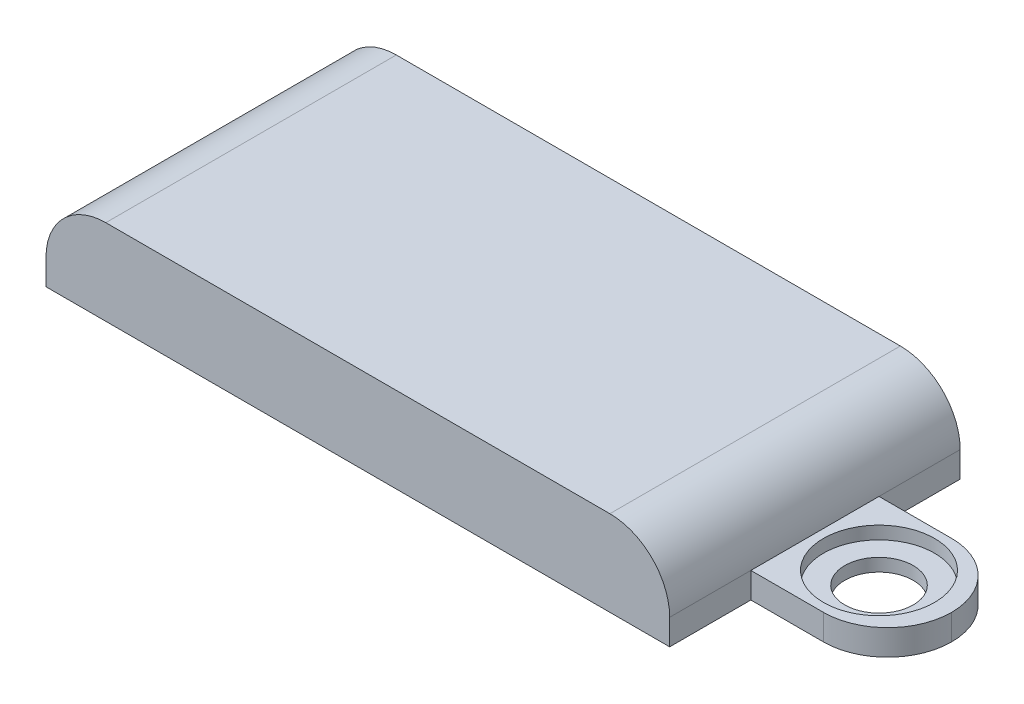
ISO-10303-21;
HEADER;
FILE_DESCRIPTION(('STEP AP214'),'2;1');
FILE_NAME('part.step','',(''),(''),'','','');
FILE_SCHEMA(('AUTOMOTIVE_DESIGN { 1 0 10303 214 1 1 1 1 }'));
ENDSEC;
DATA;
#1=APPLICATION_CONTEXT('core data for automotive mechanical design processes');
#2=APPLICATION_PROTOCOL_DEFINITION('international standard','automotive_design',2000,#1);
#3=PRODUCT_CONTEXT('',#1,'mechanical');
#4=PRODUCT('Part','Part','',(#3));
#5=PRODUCT_RELATED_PRODUCT_CATEGORY('part','',(#4));
#6=PRODUCT_DEFINITION_FORMATION('','',#4);
#7=PRODUCT_DEFINITION_CONTEXT('part definition',#1,'design');
#8=PRODUCT_DEFINITION('design','',#6,#7);
#9=PRODUCT_DEFINITION_SHAPE('','',#8);
#10=(LENGTH_UNIT() NAMED_UNIT(*) SI_UNIT(.MILLI.,.METRE.));
#11=(NAMED_UNIT(*) PLANE_ANGLE_UNIT() SI_UNIT($,.RADIAN.));
#12=(NAMED_UNIT(*) SI_UNIT($,.STERADIAN.) SOLID_ANGLE_UNIT());
#13=UNCERTAINTY_MEASURE_WITH_UNIT(LENGTH_MEASURE(1.E-05),#10,'distance_accuracy_value','');
#14=(GEOMETRIC_REPRESENTATION_CONTEXT(3) GLOBAL_UNCERTAINTY_ASSIGNED_CONTEXT((#13)) GLOBAL_UNIT_ASSIGNED_CONTEXT((#10,
#11,#12)) REPRESENTATION_CONTEXT('',''));
#15=CARTESIAN_POINT('',(0.,0.,0.));
#16=DIRECTION('',(0.,0.,1.));
#17=DIRECTION('',(1.,0.,0.));
#18=AXIS2_PLACEMENT_3D('',#15,#16,#17);
#19=CARTESIAN_POINT('',(47.5139751552795,0.,1.64052795031056));
#20=DIRECTION('',(0.,1.,0.));
#21=DIRECTION('',(0.,0.,1.));
#22=AXIS2_PLACEMENT_3D('',#19,#20,#21);
#23=CYLINDRICAL_SURFACE('',#22,4.00000000000001);
#24=CARTESIAN_POINT('',(47.5139751552795,0.,1.64052795031056));
#25=DIRECTION('',(0.,1.,0.));
#26=DIRECTION('',(0.,0.,1.));
#27=AXIS2_PLACEMENT_3D('',#24,#25,#26);
#28=CIRCLE('',#27,4.00000000000001);
#29=CARTESIAN_POINT('',(47.5139751552795,0.,5.64052795031056));
#30=VERTEX_POINT('',#29);
#31=EDGE_CURVE('E190',#30,#30,#28,.T.);
#32=ORIENTED_EDGE('',*,*,#31,.F.);
#33=EDGE_LOOP('',(#32));
#34=FACE_BOUND('',#33,.T.);
#35=CARTESIAN_POINT('',(47.5139751552795,1.5,1.64052795031056));
#36=DIRECTION('',(0.,1.,0.));
#37=DIRECTION('',(0.,0.,1.));
#38=AXIS2_PLACEMENT_3D('',#35,#36,#37);
#39=CIRCLE('',#38,4.00000000000001);
#40=CARTESIAN_POINT('',(47.5139751552795,1.5,5.64052795031056));
#41=VERTEX_POINT('',#40);
#42=EDGE_CURVE('E38',#41,#41,#39,.F.);
#43=ORIENTED_EDGE('',*,*,#42,.F.);
#44=EDGE_LOOP('',(#43));
#45=FACE_BOUND('',#44,.T.);
#46=ADVANCED_FACE('F34',(#34,#45),#23,.F.);
#47=CARTESIAN_POINT('',(40.0139751552795,10.,-15.3594720496894));
#48=DIRECTION('',(-1.,0.,0.));
#49=DIRECTION('',(0.,0.,1.));
#50=AXIS2_PLACEMENT_3D('',#47,#48,#49);
#51=PLANE('',#50);
#52=DIRECTION('',(0.,0.,-1.));
#53=VECTOR('',#52,1.);
#54=CARTESIAN_POINT('',(40.0139751552795,0.,-15.3594720496894));
#55=LINE('',#54,#53);
#56=CARTESIAN_POINT('',(40.0139751552795,0.,18.6405279503106));
#57=VERTEX_POINT('',#56);
#58=CARTESIAN_POINT('',(40.0139751552795,0.,9.14052795031055));
#59=VERTEX_POINT('',#58);
#60=EDGE_CURVE('E178',#57,#59,#55,.T.);
#61=ORIENTED_EDGE('',*,*,#60,.T.);
#62=DIRECTION('',(0.,-1.,0.));
#63=VECTOR('',#62,1.);
#64=CARTESIAN_POINT('',(40.0139751552795,3.,9.14052795031055));
#65=LINE('',#64,#63);
#66=CARTESIAN_POINT('',(40.0139751552795,3.,9.14052795031055));
#67=VERTEX_POINT('',#66);
#68=EDGE_CURVE('E156',#67,#59,#65,.T.);
#69=ORIENTED_EDGE('',*,*,#68,.F.);
#70=DIRECTION('',(0.,0.,-1.));
#71=VECTOR('',#70,1.);
#72=CARTESIAN_POINT('',(40.0139751552795,3.,18.6405279503106));
#73=LINE('',#72,#71);
#74=CARTESIAN_POINT('',(40.0139751552795,3.,18.6405279503106));
#75=VERTEX_POINT('',#74);
#76=EDGE_CURVE('E163',#67,#75,#73,.F.);
#77=ORIENTED_EDGE('',*,*,#76,.T.);
#78=DIRECTION('',(0.,-1.,0.));
#79=VECTOR('',#78,1.);
#80=CARTESIAN_POINT('',(40.0139751552795,10.,18.6405279503106));
#81=LINE('',#80,#79);
#82=EDGE_CURVE('E244',#75,#57,#81,.T.);
#83=ORIENTED_EDGE('',*,*,#82,.T.);
#84=EDGE_LOOP('',(#61,#69,#77,#83));
#85=FACE_BOUND('',#84,.T.);
#86=ADVANCED_FACE('F176',(#85),#51,.F.);
#87=CARTESIAN_POINT('',(-32.9860248447205,10.,-15.3594720496894));
#88=DIRECTION('',(1.,0.,0.));
#89=DIRECTION('',(0.,0.,-1.));
#90=AXIS2_PLACEMENT_3D('',#87,#88,#89);
#91=PLANE('',#90);
#92=DIRECTION('',(0.,-1.,0.));
#93=VECTOR('',#92,1.);
#94=CARTESIAN_POINT('',(-32.9860248447205,10.,18.6405279503106));
#95=LINE('',#94,#93);
#96=CARTESIAN_POINT('',(-32.9860248447205,3.,18.6405279503106));
#97=VERTEX_POINT('',#96);
#98=CARTESIAN_POINT('',(-32.9860248447205,0.,18.6405279503106));
#99=VERTEX_POINT('',#98);
#100=EDGE_CURVE('E246',#97,#99,#95,.T.);
#101=ORIENTED_EDGE('',*,*,#100,.F.);
#102=DIRECTION('',(0.,0.,1.));
#103=VECTOR('',#102,1.);
#104=CARTESIAN_POINT('',(-32.9860248447205,3.,-15.3594720496894));
#105=LINE('',#104,#103);
#106=CARTESIAN_POINT('',(-32.9860248447205,3.,-15.3594720496894));
#107=VERTEX_POINT('',#106);
#108=EDGE_CURVE('E278',#97,#107,#105,.F.);
#109=ORIENTED_EDGE('',*,*,#108,.T.);
#110=DIRECTION('',(0.,-1.,0.));
#111=VECTOR('',#110,1.);
#112=CARTESIAN_POINT('',(-32.9860248447205,10.,-15.3594720496894));
#113=LINE('',#112,#111);
#114=CARTESIAN_POINT('',(-32.9860248447205,0.,-15.3594720496894));
#115=VERTEX_POINT('',#114);
#116=EDGE_CURVE('E230',#107,#115,#113,.T.);
#117=ORIENTED_EDGE('',*,*,#116,.T.);
#118=DIRECTION('',(0.,0.,1.));
#119=VECTOR('',#118,1.);
#120=CARTESIAN_POINT('',(-32.9860248447205,0.,-15.3594720496894));
#121=LINE('',#120,#119);
#122=EDGE_CURVE('E217',#115,#99,#121,.T.);
#123=ORIENTED_EDGE('',*,*,#122,.T.);
#124=EDGE_LOOP('',(#101,#109,#117,#123));
#125=FACE_BOUND('',#124,.T.);
#126=ADVANCED_FACE('F326',(#125),#91,.F.);
#127=CARTESIAN_POINT('',(-32.9860248447205,10.,18.6405279503106));
#128=DIRECTION('',(0.,0.,-1.));
#129=DIRECTION('',(-1.,0.,0.));
#130=AXIS2_PLACEMENT_3D('',#127,#128,#129);
#131=PLANE('',#130);
#132=ORIENTED_EDGE('',*,*,#82,.F.);
#133=CARTESIAN_POINT('',(33.0139751552795,3.,18.6405279503106));
#134=DIRECTION('',(0.,0.,-1.));
#135=DIRECTION('',(-1.,0.,0.));
#136=AXIS2_PLACEMENT_3D('',#133,#134,#135);
#137=CIRCLE('',#136,7.);
#138=CARTESIAN_POINT('',(33.0139751552795,10.,18.6405279503106));
#139=VERTEX_POINT('',#138);
#140=EDGE_CURVE('E169',#75,#139,#137,.F.);
#141=ORIENTED_EDGE('',*,*,#140,.T.);
#142=DIRECTION('',(1.,0.,0.));
#143=VECTOR('',#142,1.);
#144=CARTESIAN_POINT('',(-32.9860248447205,10.,18.6405279503106));
#145=LINE('',#144,#143);
#146=CARTESIAN_POINT('',(-25.9860248447205,10.,18.6405279503106));
#147=VERTEX_POINT('',#146);
#148=EDGE_CURVE('E223',#147,#139,#145,.T.);
#149=ORIENTED_EDGE('',*,*,#148,.F.);
#150=CARTESIAN_POINT('',(-25.9860248447205,3.,18.6405279503106));
#151=DIRECTION('',(0.,0.,-1.));
#152=DIRECTION('',(-1.,0.,0.));
#153=AXIS2_PLACEMENT_3D('',#150,#151,#152);
#154=CIRCLE('',#153,7.);
#155=EDGE_CURVE('E275',#147,#97,#154,.F.);
#156=ORIENTED_EDGE('',*,*,#155,.T.);
#157=ORIENTED_EDGE('',*,*,#100,.T.);
#158=DIRECTION('',(1.,0.,0.));
#159=VECTOR('',#158,1.);
#160=CARTESIAN_POINT('',(-32.9860248447205,0.,18.6405279503106));
#161=LINE('',#160,#159);
#162=EDGE_CURVE('E233',#99,#57,#161,.T.);
#163=ORIENTED_EDGE('',*,*,#162,.T.);
#164=EDGE_LOOP('',(#132,#141,#149,#156,#157,#163));
#165=FACE_BOUND('',#164,.T.);
#166=ADVANCED_FACE('F359',(#165),#131,.F.);
#167=CARTESIAN_POINT('',(40.0139751552795,3.,-15.3594720496894));
#168=VERTEX_POINT('',#167);
#169=CARTESIAN_POINT('',(40.0139751552795,3.,-5.85947204968944));
#170=VERTEX_POINT('',#169);
#171=EDGE_CURVE('E172',#168,#170,#73,.F.);
#172=ORIENTED_EDGE('',*,*,#171,.T.);
#173=DIRECTION('',(0.,-1.,0.));
#174=VECTOR('',#173,1.);
#175=CARTESIAN_POINT('',(40.0139751552795,3.,-5.85947204968944));
#176=LINE('',#175,#174);
#177=CARTESIAN_POINT('',(40.0139751552795,0.,-5.85947204968944));
#178=VERTEX_POINT('',#177);
#179=EDGE_CURVE('E158',#170,#178,#176,.T.);
#180=ORIENTED_EDGE('',*,*,#179,.T.);
#181=CARTESIAN_POINT('',(40.0139751552795,0.,-15.3594720496894));
#182=VERTEX_POINT('',#181);
#183=EDGE_CURVE('E236',#178,#182,#55,.T.);
#184=ORIENTED_EDGE('',*,*,#183,.T.);
#185=DIRECTION('',(0.,-1.,0.));
#186=VECTOR('',#185,1.);
#187=CARTESIAN_POINT('',(40.0139751552795,10.,-15.3594720496894));
#188=LINE('',#187,#186);
#189=EDGE_CURVE('E241',#168,#182,#188,.T.);
#190=ORIENTED_EDGE('',*,*,#189,.F.);
#191=EDGE_LOOP('',(#172,#180,#184,#190));
#192=FACE_BOUND('',#191,.T.);
#193=ADVANCED_FACE('F328',(#192),#51,.F.);
#194=CARTESIAN_POINT('',(-32.9860248447205,10.,-15.3594720496894));
#195=DIRECTION('',(0.,0.,1.));
#196=DIRECTION('',(1.,0.,0.));
#197=AXIS2_PLACEMENT_3D('',#194,#195,#196);
#198=PLANE('',#197);
#199=DIRECTION('',(-1.,0.,0.));
#200=VECTOR('',#199,1.);
#201=CARTESIAN_POINT('',(-32.9860248447205,10.,-15.3594720496894));
#202=LINE('',#201,#200);
#203=CARTESIAN_POINT('',(33.0139751552795,10.,-15.3594720496894));
#204=VERTEX_POINT('',#203);
#205=CARTESIAN_POINT('',(-25.9860248447205,10.,-15.3594720496894));
#206=VERTEX_POINT('',#205);
#207=EDGE_CURVE('E226',#204,#206,#202,.T.);
#208=ORIENTED_EDGE('',*,*,#207,.F.);
#209=CARTESIAN_POINT('',(33.0139751552795,3.,-15.3594720496894));
#210=DIRECTION('',(0.,0.,1.));
#211=DIRECTION('',(1.,0.,0.));
#212=AXIS2_PLACEMENT_3D('',#209,#210,#211);
#213=CIRCLE('',#212,7.);
#214=EDGE_CURVE('E173',#204,#168,#213,.F.);
#215=ORIENTED_EDGE('',*,*,#214,.T.);
#216=ORIENTED_EDGE('',*,*,#189,.T.);
#217=DIRECTION('',(-1.,0.,0.));
#218=VECTOR('',#217,1.);
#219=CARTESIAN_POINT('',(-32.9860248447205,0.,-15.3594720496894));
#220=LINE('',#219,#218);
#221=EDGE_CURVE('E227',#182,#115,#220,.T.);
#222=ORIENTED_EDGE('',*,*,#221,.T.);
#223=ORIENTED_EDGE('',*,*,#116,.F.);
#224=CARTESIAN_POINT('',(-25.9860248447205,3.,-15.3594720496894));
#225=DIRECTION('',(0.,0.,1.));
#226=DIRECTION('',(1.,0.,0.));
#227=AXIS2_PLACEMENT_3D('',#224,#225,#226);
#228=CIRCLE('',#227,7.);
#229=EDGE_CURVE('E272',#107,#206,#228,.F.);
#230=ORIENTED_EDGE('',*,*,#229,.T.);
#231=EDGE_LOOP('',(#208,#215,#216,#222,#223,#230));
#232=FACE_BOUND('',#231,.T.);
#233=ADVANCED_FACE('F365',(#232),#198,.F.);
#234=CARTESIAN_POINT('',(0.,10.,0.));
#235=DIRECTION('',(0.,1.,0.));
#236=DIRECTION('',(0.,0.,1.));
#237=AXIS2_PLACEMENT_3D('',#234,#235,#236);
#238=PLANE('',#237);
#239=ORIENTED_EDGE('',*,*,#148,.T.);
#240=DIRECTION('',(0.,0.,-1.));
#241=VECTOR('',#240,1.);
#242=CARTESIAN_POINT('',(33.0139751552795,10.,-15.3594720496894));
#243=LINE('',#242,#241);
#244=EDGE_CURVE('E269',#139,#204,#243,.T.);
#245=ORIENTED_EDGE('',*,*,#244,.T.);
#246=ORIENTED_EDGE('',*,*,#207,.T.);
#247=DIRECTION('',(0.,0.,1.));
#248=VECTOR('',#247,1.);
#249=CARTESIAN_POINT('',(-25.9860248447205,10.,18.6405279503106));
#250=LINE('',#249,#248);
#251=EDGE_CURVE('E266',#206,#147,#250,.T.);
#252=ORIENTED_EDGE('',*,*,#251,.T.);
#253=EDGE_LOOP('',(#239,#245,#246,#252));
#254=FACE_BOUND('',#253,.T.);
#255=ADVANCED_FACE('F369',(#254),#238,.T.);
#256=CARTESIAN_POINT('',(0.,0.,0.));
#257=DIRECTION('',(0.,1.,0.));
#258=DIRECTION('',(0.,0.,1.));
#259=AXIS2_PLACEMENT_3D('',#256,#257,#258);
#260=PLANE('',#259);
#261=ORIENTED_EDGE('',*,*,#31,.T.);
#262=EDGE_LOOP('',(#261));
#263=FACE_BOUND('',#262,.T.);
#264=DIRECTION('',(1.,0.,0.));
#265=VECTOR('',#264,1.);
#266=CARTESIAN_POINT('',(-31.4860248447205,0.,-13.8594720496894));
#267=LINE('',#266,#265);
#268=CARTESIAN_POINT('',(-31.4860248447205,0.,-13.8594720496894));
#269=VERTEX_POINT('',#268);
#270=CARTESIAN_POINT('',(38.5139751552795,0.,-13.8594720496894));
#271=VERTEX_POINT('',#270);
#272=EDGE_CURVE('E207',#269,#271,#267,.T.);
#273=ORIENTED_EDGE('',*,*,#272,.F.);
#274=DIRECTION('',(0.,0.,-1.));
#275=VECTOR('',#274,1.);
#276=CARTESIAN_POINT('',(-31.4860248447205,0.,17.1405279503106));
#277=LINE('',#276,#275);
#278=CARTESIAN_POINT('',(-31.4860248447205,0.,17.1405279503106));
#279=VERTEX_POINT('',#278);
#280=EDGE_CURVE('E179',#279,#269,#277,.T.);
#281=ORIENTED_EDGE('',*,*,#280,.F.);
#282=DIRECTION('',(-1.,0.,0.));
#283=VECTOR('',#282,1.);
#284=CARTESIAN_POINT('',(-31.4860248447205,0.,17.1405279503106));
#285=LINE('',#284,#283);
#286=CARTESIAN_POINT('',(38.5139751552795,0.,17.1405279503106));
#287=VERTEX_POINT('',#286);
#288=EDGE_CURVE('E201',#287,#279,#285,.T.);
#289=ORIENTED_EDGE('',*,*,#288,.F.);
#290=DIRECTION('',(0.,0.,1.));
#291=VECTOR('',#290,1.);
#292=CARTESIAN_POINT('',(38.5139751552795,0.,17.1405279503106));
#293=LINE('',#292,#291);
#294=EDGE_CURVE('E210',#271,#287,#293,.T.);
#295=ORIENTED_EDGE('',*,*,#294,.F.);
#296=EDGE_LOOP('',(#273,#281,#289,#295));
#297=FACE_BOUND('',#296,.T.);
#298=DIRECTION('',(1.,0.,0.));
#299=VECTOR('',#298,1.);
#300=CARTESIAN_POINT('',(40.0139751552795,0.,-5.85947204968944));
#301=LINE('',#300,#299);
#302=CARTESIAN_POINT('',(48.5139751552795,0.,-5.85947204968944));
#303=VERTEX_POINT('',#302);
#304=EDGE_CURVE('E187',#178,#303,#301,.T.);
#305=ORIENTED_EDGE('',*,*,#304,.T.);
#306=CARTESIAN_POINT('',(48.5139751552795,0.,1.64052795031056));
#307=DIRECTION('',(0.,1.,0.));
#308=DIRECTION('',(0.,0.,1.));
#309=AXIS2_PLACEMENT_3D('',#306,#307,#308);
#310=CIRCLE('',#309,7.5);
#311=CARTESIAN_POINT('',(56.0139751552795,0.,1.64052795031056));
#312=VERTEX_POINT('',#311);
#313=EDGE_CURVE('E285',#303,#312,#310,.F.);
#314=ORIENTED_EDGE('',*,*,#313,.T.);
#315=CARTESIAN_POINT('',(48.5139751552795,0.,1.64052795031056));
#316=DIRECTION('',(0.,1.,0.));
#317=DIRECTION('',(0.,0.,1.));
#318=AXIS2_PLACEMENT_3D('',#315,#316,#317);
#319=CIRCLE('',#318,7.5);
#320=CARTESIAN_POINT('',(48.5139751552795,0.,9.14052795031056));
#321=VERTEX_POINT('',#320);
#322=EDGE_CURVE('E283',#312,#321,#319,.F.);
#323=ORIENTED_EDGE('',*,*,#322,.T.);
#324=DIRECTION('',(-1.,0.,0.));
#325=VECTOR('',#324,1.);
#326=CARTESIAN_POINT('',(40.0139751552795,0.,9.14052795031055));
#327=LINE('',#326,#325);
#328=EDGE_CURVE('E184',#321,#59,#327,.T.);
#329=ORIENTED_EDGE('',*,*,#328,.T.);
#330=ORIENTED_EDGE('',*,*,#60,.F.);
#331=ORIENTED_EDGE('',*,*,#162,.F.);
#332=ORIENTED_EDGE('',*,*,#122,.F.);
#333=ORIENTED_EDGE('',*,*,#221,.F.);
#334=ORIENTED_EDGE('',*,*,#183,.F.);
#335=EDGE_LOOP('',(#305,#314,#323,#329,#330,#331,#332,#333,#334));
#336=FACE_BOUND('',#335,.T.);
#337=ADVANCED_FACE('F371',(#263,#297,#336),#260,.F.);
#338=CARTESIAN_POINT('',(-31.4860248447205,8.5,17.1405279503106));
#339=DIRECTION('',(-1.,0.,0.));
#340=DIRECTION('',(0.,0.,1.));
#341=AXIS2_PLACEMENT_3D('',#338,#339,#340);
#342=PLANE('',#341);
#343=DIRECTION('',(0.,-1.,0.));
#344=VECTOR('',#343,1.);
#345=CARTESIAN_POINT('',(-31.4860248447205,8.5,-13.8594720496894));
#346=LINE('',#345,#344);
#347=CARTESIAN_POINT('',(-31.4860248447205,3.,-13.8594720496894));
#348=VERTEX_POINT('',#347);
#349=EDGE_CURVE('E204',#348,#269,#346,.T.);
#350=ORIENTED_EDGE('',*,*,#349,.F.);
#351=DIRECTION('',(0.,0.,-1.));
#352=VECTOR('',#351,1.);
#353=CARTESIAN_POINT('',(-31.4860248447205,3.,17.1405279503106));
#354=LINE('',#353,#352);
#355=CARTESIAN_POINT('',(-31.4860248447205,3.,17.1405279503106));
#356=VERTEX_POINT('',#355);
#357=EDGE_CURVE('E264',#348,#356,#354,.F.);
#358=ORIENTED_EDGE('',*,*,#357,.T.);
#359=DIRECTION('',(0.,-1.,0.));
#360=VECTOR('',#359,1.);
#361=CARTESIAN_POINT('',(-31.4860248447205,8.5,17.1405279503106));
#362=LINE('',#361,#360);
#363=EDGE_CURVE('E215',#356,#279,#362,.T.);
#364=ORIENTED_EDGE('',*,*,#363,.T.);
#365=ORIENTED_EDGE('',*,*,#280,.T.);
#366=EDGE_LOOP('',(#350,#358,#364,#365));
#367=FACE_BOUND('',#366,.T.);
#368=ADVANCED_FACE('F374',(#367),#342,.F.);
#369=CARTESIAN_POINT('',(-31.4860248447205,8.5,17.1405279503106));
#370=DIRECTION('',(0.,0.,1.));
#371=DIRECTION('',(1.,0.,0.));
#372=AXIS2_PLACEMENT_3D('',#369,#370,#371);
#373=PLANE('',#372);
#374=DIRECTION('',(-1.,0.,0.));
#375=VECTOR('',#374,1.);
#376=CARTESIAN_POINT('',(-31.4860248447205,8.5,17.1405279503106));
#377=LINE('',#376,#375);
#378=CARTESIAN_POINT('',(33.0139751552795,8.5,17.1405279503106));
#379=VERTEX_POINT('',#378);
#380=CARTESIAN_POINT('',(-25.9860248447205,8.5,17.1405279503106));
#381=VERTEX_POINT('',#380);
#382=EDGE_CURVE('E200',#379,#381,#377,.T.);
#383=ORIENTED_EDGE('',*,*,#382,.F.);
#384=CARTESIAN_POINT('',(33.0139751552795,3.,17.1405279503106));
#385=DIRECTION('',(0.,0.,1.));
#386=DIRECTION('',(1.,0.,0.));
#387=AXIS2_PLACEMENT_3D('',#384,#385,#386);
#388=CIRCLE('',#387,5.5);
#389=CARTESIAN_POINT('',(38.5139751552795,3.,17.1405279503106));
#390=VERTEX_POINT('',#389);
#391=EDGE_CURVE('E256',#379,#390,#388,.F.);
#392=ORIENTED_EDGE('',*,*,#391,.T.);
#393=DIRECTION('',(0.,-1.,0.));
#394=VECTOR('',#393,1.);
#395=CARTESIAN_POINT('',(38.5139751552795,8.5,17.1405279503106));
#396=LINE('',#395,#394);
#397=EDGE_CURVE('E218',#390,#287,#396,.T.);
#398=ORIENTED_EDGE('',*,*,#397,.T.);
#399=ORIENTED_EDGE('',*,*,#288,.T.);
#400=ORIENTED_EDGE('',*,*,#363,.F.);
#401=CARTESIAN_POINT('',(-25.9860248447205,3.,17.1405279503106));
#402=DIRECTION('',(0.,0.,1.));
#403=DIRECTION('',(1.,0.,0.));
#404=AXIS2_PLACEMENT_3D('',#401,#402,#403);
#405=CIRCLE('',#404,5.5);
#406=EDGE_CURVE('E254',#356,#381,#405,.F.);
#407=ORIENTED_EDGE('',*,*,#406,.T.);
#408=EDGE_LOOP('',(#383,#392,#398,#399,#400,#407));
#409=FACE_BOUND('',#408,.T.);
#410=ADVANCED_FACE('F380',(#409),#373,.F.);
#411=CARTESIAN_POINT('',(38.5139751552795,8.5,17.1405279503106));
#412=DIRECTION('',(1.,0.,0.));
#413=DIRECTION('',(0.,0.,-1.));
#414=AXIS2_PLACEMENT_3D('',#411,#412,#413);
#415=PLANE('',#414);
#416=ORIENTED_EDGE('',*,*,#397,.F.);
#417=DIRECTION('',(0.,0.,1.));
#418=VECTOR('',#417,1.);
#419=CARTESIAN_POINT('',(38.5139751552795,3.,17.1405279503106));
#420=LINE('',#419,#418);
#421=CARTESIAN_POINT('',(38.5139751552795,3.,-13.8594720496894));
#422=VERTEX_POINT('',#421);
#423=EDGE_CURVE('E258',#390,#422,#420,.F.);
#424=ORIENTED_EDGE('',*,*,#423,.T.);
#425=DIRECTION('',(0.,-1.,0.));
#426=VECTOR('',#425,1.);
#427=CARTESIAN_POINT('',(38.5139751552795,8.5,-13.8594720496894));
#428=LINE('',#427,#426);
#429=EDGE_CURVE('E220',#422,#271,#428,.T.);
#430=ORIENTED_EDGE('',*,*,#429,.T.);
#431=ORIENTED_EDGE('',*,*,#294,.T.);
#432=EDGE_LOOP('',(#416,#424,#430,#431));
#433=FACE_BOUND('',#432,.T.);
#434=ADVANCED_FACE('F385',(#433),#415,.F.);
#435=CARTESIAN_POINT('',(-31.4860248447205,8.5,-13.8594720496894));
#436=DIRECTION('',(0.,0.,-1.));
#437=DIRECTION('',(-1.,0.,0.));
#438=AXIS2_PLACEMENT_3D('',#435,#436,#437);
#439=PLANE('',#438);
#440=ORIENTED_EDGE('',*,*,#429,.F.);
#441=CARTESIAN_POINT('',(33.0139751552795,3.,-13.8594720496894));
#442=DIRECTION('',(0.,0.,-1.));
#443=DIRECTION('',(-1.,0.,0.));
#444=AXIS2_PLACEMENT_3D('',#441,#442,#443);
#445=CIRCLE('',#444,5.5);
#446=CARTESIAN_POINT('',(33.0139751552795,8.5,-13.8594720496894));
#447=VERTEX_POINT('',#446);
#448=EDGE_CURVE('E262',#422,#447,#445,.F.);
#449=ORIENTED_EDGE('',*,*,#448,.T.);
#450=DIRECTION('',(1.,0.,0.));
#451=VECTOR('',#450,1.);
#452=CARTESIAN_POINT('',(-31.4860248447205,8.5,-13.8594720496894));
#453=LINE('',#452,#451);
#454=CARTESIAN_POINT('',(-25.9860248447205,8.5,-13.8594720496894));
#455=VERTEX_POINT('',#454);
#456=EDGE_CURVE('E197',#455,#447,#453,.T.);
#457=ORIENTED_EDGE('',*,*,#456,.F.);
#458=CARTESIAN_POINT('',(-25.9860248447205,3.,-13.8594720496894));
#459=DIRECTION('',(0.,0.,-1.));
#460=DIRECTION('',(-1.,0.,0.));
#461=AXIS2_PLACEMENT_3D('',#458,#459,#460);
#462=CIRCLE('',#461,5.5);
#463=EDGE_CURVE('E260',#455,#348,#462,.F.);
#464=ORIENTED_EDGE('',*,*,#463,.T.);
#465=ORIENTED_EDGE('',*,*,#349,.T.);
#466=ORIENTED_EDGE('',*,*,#272,.T.);
#467=EDGE_LOOP('',(#440,#449,#457,#464,#465,#466));
#468=FACE_BOUND('',#467,.T.);
#469=ADVANCED_FACE('F382',(#468),#439,.F.);
#470=CARTESIAN_POINT('',(0.,8.5,0.));
#471=DIRECTION('',(0.,-1.,0.));
#472=DIRECTION('',(0.,0.,-1.));
#473=AXIS2_PLACEMENT_3D('',#470,#471,#472);
#474=PLANE('',#473);
#475=ORIENTED_EDGE('',*,*,#456,.T.);
#476=DIRECTION('',(0.,0.,1.));
#477=VECTOR('',#476,1.);
#478=CARTESIAN_POINT('',(33.0139751552795,8.5,0.));
#479=LINE('',#478,#477);
#480=EDGE_CURVE('E251',#447,#379,#479,.T.);
#481=ORIENTED_EDGE('',*,*,#480,.T.);
#482=ORIENTED_EDGE('',*,*,#382,.T.);
#483=DIRECTION('',(0.,0.,-1.));
#484=VECTOR('',#483,1.);
#485=CARTESIAN_POINT('',(-25.9860248447205,8.5,0.));
#486=LINE('',#485,#484);
#487=EDGE_CURVE('E248',#381,#455,#486,.T.);
#488=ORIENTED_EDGE('',*,*,#487,.T.);
#489=EDGE_LOOP('',(#475,#481,#482,#488));
#490=FACE_BOUND('',#489,.T.);
#491=ADVANCED_FACE('F355',(#490),#474,.T.);
#492=CARTESIAN_POINT('',(33.0139751552795,3.,0.));
#493=DIRECTION('',(0.,0.,1.));
#494=DIRECTION('',(1.,0.,0.));
#495=AXIS2_PLACEMENT_3D('',#492,#493,#494);
#496=CYLINDRICAL_SURFACE('',#495,5.5);
#497=ORIENTED_EDGE('',*,*,#448,.F.);
#498=ORIENTED_EDGE('',*,*,#423,.F.);
#499=ORIENTED_EDGE('',*,*,#391,.F.);
#500=ORIENTED_EDGE('',*,*,#480,.F.);
#501=EDGE_LOOP('',(#497,#498,#499,#500));
#502=FACE_BOUND('',#501,.T.);
#503=ADVANCED_FACE('F351',(#502),#496,.F.);
#504=CARTESIAN_POINT('',(-25.9860248447205,3.,0.));
#505=DIRECTION('',(0.,0.,-1.));
#506=DIRECTION('',(-1.,0.,0.));
#507=AXIS2_PLACEMENT_3D('',#504,#505,#506);
#508=CYLINDRICAL_SURFACE('',#507,5.5);
#509=ORIENTED_EDGE('',*,*,#406,.F.);
#510=ORIENTED_EDGE('',*,*,#357,.F.);
#511=ORIENTED_EDGE('',*,*,#463,.F.);
#512=ORIENTED_EDGE('',*,*,#487,.F.);
#513=EDGE_LOOP('',(#509,#510,#511,#512));
#514=FACE_BOUND('',#513,.T.);
#515=ADVANCED_FACE('F348',(#514),#508,.F.);
#516=CARTESIAN_POINT('',(33.0139751552795,3.,0.));
#517=DIRECTION('',(0.,0.,1.));
#518=DIRECTION('',(1.,0.,0.));
#519=AXIS2_PLACEMENT_3D('',#516,#517,#518);
#520=CYLINDRICAL_SURFACE('',#519,7.);
#521=ORIENTED_EDGE('',*,*,#140,.F.);
#522=ORIENTED_EDGE('',*,*,#76,.F.);
#523=DIRECTION('',(0.,0.,-1.));
#524=VECTOR('',#523,1.);
#525=CARTESIAN_POINT('',(40.0139751552795,3.,9.14052795031055));
#526=LINE('',#525,#524);
#527=EDGE_CURVE('E166',#67,#170,#526,.T.);
#528=ORIENTED_EDGE('',*,*,#527,.T.);
#529=ORIENTED_EDGE('',*,*,#171,.F.);
#530=ORIENTED_EDGE('',*,*,#214,.F.);
#531=ORIENTED_EDGE('',*,*,#244,.F.);
#532=EDGE_LOOP('',(#521,#522,#528,#529,#530,#531));
#533=FACE_BOUND('',#532,.T.);
#534=ADVANCED_FACE('F164',(#533),#520,.T.);
#535=CARTESIAN_POINT('',(-25.9860248447205,3.,0.));
#536=DIRECTION('',(0.,0.,-1.));
#537=DIRECTION('',(-1.,0.,0.));
#538=AXIS2_PLACEMENT_3D('',#535,#536,#537);
#539=CYLINDRICAL_SURFACE('',#538,7.);
#540=ORIENTED_EDGE('',*,*,#229,.F.);
#541=ORIENTED_EDGE('',*,*,#108,.F.);
#542=ORIENTED_EDGE('',*,*,#155,.F.);
#543=ORIENTED_EDGE('',*,*,#251,.F.);
#544=EDGE_LOOP('',(#540,#541,#542,#543));
#545=FACE_BOUND('',#544,.T.);
#546=ADVANCED_FACE('F342',(#545),#539,.T.);
#547=CARTESIAN_POINT('',(40.0139751552795,3.,9.14052795031055));
#548=DIRECTION('',(0.,0.,1.));
#549=DIRECTION('',(1.,0.,0.));
#550=AXIS2_PLACEMENT_3D('',#547,#548,#549);
#551=PLANE('',#550);
#552=ORIENTED_EDGE('',*,*,#328,.F.);
#553=DIRECTION('',(0.,-1.,0.));
#554=VECTOR('',#553,1.);
#555=CARTESIAN_POINT('',(48.5139751552795,3.,9.14052795031056));
#556=LINE('',#555,#554);
#557=CARTESIAN_POINT('',(48.5139751552795,3.,9.14052795031056));
#558=VERTEX_POINT('',#557);
#559=EDGE_CURVE('E11',#321,#558,#556,.F.);
#560=ORIENTED_EDGE('',*,*,#559,.T.);
#561=DIRECTION('',(-1.,0.,0.));
#562=VECTOR('',#561,1.);
#563=CARTESIAN_POINT('',(40.0139751552795,3.,9.14052795031055));
#564=LINE('',#563,#562);
#565=EDGE_CURVE('E152',#558,#67,#564,.T.);
#566=ORIENTED_EDGE('',*,*,#565,.T.);
#567=ORIENTED_EDGE('',*,*,#68,.T.);
#568=EDGE_LOOP('',(#552,#560,#566,#567));
#569=FACE_BOUND('',#568,.T.);
#570=ADVANCED_FACE('F154',(#569),#551,.T.);
#571=CARTESIAN_POINT('',(40.0139751552795,3.,-5.85947204968944));
#572=DIRECTION('',(0.,0.,-1.));
#573=DIRECTION('',(-1.,0.,0.));
#574=AXIS2_PLACEMENT_3D('',#571,#572,#573);
#575=PLANE('',#574);
#576=DIRECTION('',(1.,0.,0.));
#577=VECTOR('',#576,1.);
#578=CARTESIAN_POINT('',(40.0139751552795,3.,-5.85947204968944));
#579=LINE('',#578,#577);
#580=CARTESIAN_POINT('',(48.5139751552795,3.,-5.85947204968944));
#581=VERTEX_POINT('',#580);
#582=EDGE_CURVE('E159',#170,#581,#579,.T.);
#583=ORIENTED_EDGE('',*,*,#582,.T.);
#584=DIRECTION('',(0.,-1.,0.));
#585=VECTOR('',#584,1.);
#586=CARTESIAN_POINT('',(48.5139751552795,3.,-5.85947204968944));
#587=LINE('',#586,#585);
#588=EDGE_CURVE('E280',#581,#303,#587,.T.);
#589=ORIENTED_EDGE('',*,*,#588,.T.);
#590=ORIENTED_EDGE('',*,*,#304,.F.);
#591=ORIENTED_EDGE('',*,*,#179,.F.);
#592=EDGE_LOOP('',(#583,#589,#590,#591));
#593=FACE_BOUND('',#592,.T.);
#594=ADVANCED_FACE('F309',(#593),#575,.T.);
#595=CARTESIAN_POINT('',(0.,3.,0.));
#596=DIRECTION('',(0.,-1.,0.));
#597=DIRECTION('',(0.,0.,-1.));
#598=AXIS2_PLACEMENT_3D('',#595,#596,#597);
#599=PLANE('',#598);
#600=CARTESIAN_POINT('',(47.5139751552795,3.,1.64052795031056));
#601=DIRECTION('',(0.,1.,0.));
#602=DIRECTION('',(0.,0.,1.));
#603=AXIS2_PLACEMENT_3D('',#600,#601,#602);
#604=CIRCLE('',#603,6.5);
#605=CARTESIAN_POINT('',(47.5139751552795,3.,8.14052795031056));
#606=VERTEX_POINT('',#605);
#607=EDGE_CURVE('E299',#606,#606,#604,.T.);
#608=ORIENTED_EDGE('',*,*,#607,.F.);
#609=EDGE_LOOP('',(#608));
#610=FACE_BOUND('',#609,.T.);
#611=CARTESIAN_POINT('',(48.5139751552795,3.,1.64052795031056));
#612=DIRECTION('',(0.,-1.,0.));
#613=DIRECTION('',(0.,0.,-1.));
#614=AXIS2_PLACEMENT_3D('',#611,#612,#613);
#615=CIRCLE('',#614,7.5);
#616=CARTESIAN_POINT('',(56.0139751552795,3.,1.64052795031056));
#617=VERTEX_POINT('',#616);
#618=EDGE_CURVE('E51',#558,#617,#615,.F.);
#619=ORIENTED_EDGE('',*,*,#618,.T.);
#620=CARTESIAN_POINT('',(48.5139751552795,3.,1.64052795031056));
#621=DIRECTION('',(0.,-1.,0.));
#622=DIRECTION('',(0.,0.,-1.));
#623=AXIS2_PLACEMENT_3D('',#620,#621,#622);
#624=CIRCLE('',#623,7.5);
#625=EDGE_CURVE('E43',#617,#581,#624,.F.);
#626=ORIENTED_EDGE('',*,*,#625,.T.);
#627=ORIENTED_EDGE('',*,*,#582,.F.);
#628=ORIENTED_EDGE('',*,*,#527,.F.);
#629=ORIENTED_EDGE('',*,*,#565,.F.);
#630=EDGE_LOOP('',(#619,#626,#627,#628,#629));
#631=FACE_BOUND('',#630,.T.);
#632=ADVANCED_FACE('F182',(#610,#631),#599,.F.);
#633=CARTESIAN_POINT('',(48.5139751552795,3.,1.64052795031056));
#634=DIRECTION('',(0.,-1.,0.));
#635=DIRECTION('',(0.,0.,-1.));
#636=AXIS2_PLACEMENT_3D('',#633,#634,#635);
#637=CYLINDRICAL_SURFACE('',#636,7.5);
#638=DIRECTION('',(0.,-1.,0.));
#639=VECTOR('',#638,1.);
#640=CARTESIAN_POINT('',(56.0139751552795,3.,1.64052795031056));
#641=LINE('',#640,#639);
#642=EDGE_CURVE('E194',#617,#312,#641,.T.);
#643=ORIENTED_EDGE('',*,*,#642,.F.);
#644=ORIENTED_EDGE('',*,*,#618,.F.);
#645=ORIENTED_EDGE('',*,*,#559,.F.);
#646=ORIENTED_EDGE('',*,*,#322,.F.);
#647=EDGE_LOOP('',(#643,#644,#645,#646));
#648=FACE_BOUND('',#647,.T.);
#649=ADVANCED_FACE('F36',(#648),#637,.T.);
#650=CARTESIAN_POINT('',(48.5139751552795,3.,1.64052795031056));
#651=DIRECTION('',(0.,-1.,0.));
#652=DIRECTION('',(0.,0.,-1.));
#653=AXIS2_PLACEMENT_3D('',#650,#651,#652);
#654=CYLINDRICAL_SURFACE('',#653,7.5);
#655=ORIENTED_EDGE('',*,*,#625,.F.);
#656=ORIENTED_EDGE('',*,*,#642,.T.);
#657=ORIENTED_EDGE('',*,*,#313,.F.);
#658=ORIENTED_EDGE('',*,*,#588,.F.);
#659=EDGE_LOOP('',(#655,#656,#657,#658));
#660=FACE_BOUND('',#659,.T.);
#661=ADVANCED_FACE('F315',(#660),#654,.T.);
#662=CARTESIAN_POINT('',(47.5139751552795,1.5,1.64052795031056));
#663=DIRECTION('',(0.,1.,0.));
#664=DIRECTION('',(0.,0.,1.));
#665=AXIS2_PLACEMENT_3D('',#662,#663,#664);
#666=PLANE('',#665);
#667=CARTESIAN_POINT('',(47.5139751552795,1.5,1.64052795031056));
#668=DIRECTION('',(0.,1.,0.));
#669=DIRECTION('',(0.,0.,1.));
#670=AXIS2_PLACEMENT_3D('',#667,#668,#669);
#671=CIRCLE('',#670,6.5);
#672=CARTESIAN_POINT('',(47.5139751552795,1.5,8.14052795031056));
#673=VERTEX_POINT('',#672);
#674=EDGE_CURVE('E295',#673,#673,#671,.T.);
#675=ORIENTED_EDGE('',*,*,#674,.T.);
#676=EDGE_LOOP('',(#675));
#677=FACE_BOUND('',#676,.T.);
#678=ORIENTED_EDGE('',*,*,#42,.T.);
#679=EDGE_LOOP('',(#678));
#680=FACE_BOUND('',#679,.T.);
#681=ADVANCED_FACE('F333',(#677,#680),#666,.T.);
#682=CARTESIAN_POINT('',(47.5139751552795,1.5,1.64052795031056));
#683=DIRECTION('',(0.,1.,0.));
#684=DIRECTION('',(0.,0.,1.));
#685=AXIS2_PLACEMENT_3D('',#682,#683,#684);
#686=CYLINDRICAL_SURFACE('',#685,6.5);
#687=ORIENTED_EDGE('',*,*,#674,.F.);
#688=EDGE_LOOP('',(#687));
#689=FACE_BOUND('',#688,.T.);
#690=ORIENTED_EDGE('',*,*,#607,.T.);
#691=EDGE_LOOP('',(#690));
#692=FACE_BOUND('',#691,.T.);
#693=ADVANCED_FACE('F306',(#689,#692),#686,.F.);
#694=CLOSED_SHELL('',(#46,#86,#126,#166,#193,#233,#255,#337,#368,#410,#434,#469,#491,#503,#515,
#534,#546,#570,#594,#632,#649,#661,#681,#693));
#695=MANIFOLD_SOLID_BREP('B2',#694);
#696=ADVANCED_BREP_SHAPE_REPRESENTATION('',(#18,#695),#14);
#697=SHAPE_DEFINITION_REPRESENTATION(#9,#696);
ENDSEC;
END-ISO-10303-21;
